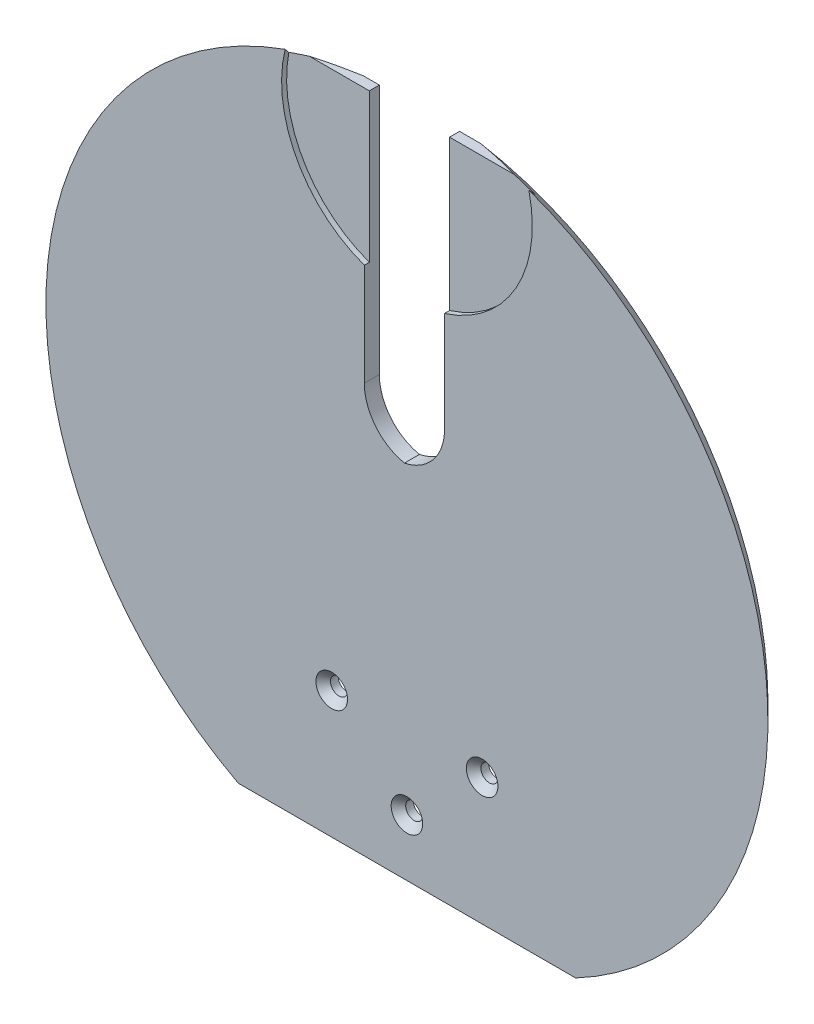
ISO-10303-21;
HEADER;
FILE_DESCRIPTION(('STEP AP214'),'2;1');
FILE_NAME('part.step','',(''),(''),'','','');
FILE_SCHEMA(('AUTOMOTIVE_DESIGN { 1 0 10303 214 1 1 1 1 }'));
ENDSEC;
DATA;
#1=APPLICATION_CONTEXT('core data for automotive mechanical design processes');
#2=APPLICATION_PROTOCOL_DEFINITION('international standard','automotive_design',2000,#1);
#3=PRODUCT_CONTEXT('',#1,'mechanical');
#4=PRODUCT('Part','Part','',(#3));
#5=PRODUCT_RELATED_PRODUCT_CATEGORY('part','',(#4));
#6=PRODUCT_DEFINITION_FORMATION('','',#4);
#7=PRODUCT_DEFINITION_CONTEXT('part definition',#1,'design');
#8=PRODUCT_DEFINITION('design','',#6,#7);
#9=PRODUCT_DEFINITION_SHAPE('','',#8);
#10=(LENGTH_UNIT() NAMED_UNIT(*) SI_UNIT(.MILLI.,.METRE.));
#11=(NAMED_UNIT(*) PLANE_ANGLE_UNIT() SI_UNIT($,.RADIAN.));
#12=(NAMED_UNIT(*) SI_UNIT($,.STERADIAN.) SOLID_ANGLE_UNIT());
#13=UNCERTAINTY_MEASURE_WITH_UNIT(LENGTH_MEASURE(1.E-05),#10,'distance_accuracy_value','');
#14=(GEOMETRIC_REPRESENTATION_CONTEXT(3) GLOBAL_UNCERTAINTY_ASSIGNED_CONTEXT((#13)) GLOBAL_UNIT_ASSIGNED_CONTEXT((#10,
#11,#12)) REPRESENTATION_CONTEXT('',''));
#15=CARTESIAN_POINT('',(0.,0.,0.));
#16=DIRECTION('',(0.,0.,1.));
#17=DIRECTION('',(1.,0.,0.));
#18=AXIS2_PLACEMENT_3D('',#15,#16,#17);
#19=CARTESIAN_POINT('',(-23.6643191323984,68.,3.));
#20=DIRECTION('',(0.,1.,0.));
#21=DIRECTION('',(0.,0.,1.));
#22=AXIS2_PLACEMENT_3D('',#19,#20,#21);
#23=PLANE('',#22);
#24=DIRECTION('',(1.,0.,0.));
#25=VECTOR('',#24,1.);
#26=CARTESIAN_POINT('',(-23.6643191323984,68.,0.));
#27=LINE('',#26,#25);
#28=CARTESIAN_POINT('',(-11.7046999107196,68.,0.));
#29=VERTEX_POINT('',#28);
#30=CARTESIAN_POINT('',(-8.5,68.,0.));
#31=VERTEX_POINT('',#30);
#32=EDGE_CURVE('E157',#29,#31,#27,.T.);
#33=ORIENTED_EDGE('',*,*,#32,.F.);
#34=CARTESIAN_POINT('',(-11.7046999107196,68.,0.));
#35=CARTESIAN_POINT('',(-12.440110253688,68.,0.124734298754301));
#36=CARTESIAN_POINT('',(-13.173608270418,68.,0.26059463660482));
#37=CARTESIAN_POINT('',(-14.63576092202,68.,0.55352933296997));
#38=CARTESIAN_POINT('',(-15.3644189074886,68.,0.710586951614213));
#39=CARTESIAN_POINT('',(-16.8170010181986,68.,1.04507049537918));
#40=CARTESIAN_POINT('',(-17.5409253245415,68.,1.22249563640126));
#41=CARTESIAN_POINT('',(-18.9843193426117,68.,1.59686914311133));
#42=CARTESIAN_POINT('',(-19.7037851070124,68.,1.79383274023498));
#43=CARTESIAN_POINT('',(-20.4205778566621,68.,2.00000000000001));
#44=B_SPLINE_CURVE_WITH_KNOTS('',3,(#34,#35,#36,#37,#38,#39,#40,#41,#42,#43),.UNSPECIFIED.,.F.,
.F.,(4,2,2,2,4),(0.,2.23761978079426,4.47348270177668,6.70925957648,8.94679328311503),.UNSPECIFIED.);
#45=CARTESIAN_POINT('',(-20.4205778566621,68.,2.));
#46=VERTEX_POINT('',#45);
#47=EDGE_CURVE('E284',#29,#46,#44,.T.);
#48=ORIENTED_EDGE('',*,*,#47,.T.);
#49=DIRECTION('',(1.,0.,0.));
#50=VECTOR('',#49,1.);
#51=CARTESIAN_POINT('',(-23.6643191323984,68.,2.));
#52=LINE('',#51,#50);
#53=CARTESIAN_POINT('',(-8.5,68.,2.));
#54=VERTEX_POINT('',#53);
#55=EDGE_CURVE('E178',#46,#54,#52,.T.);
#56=ORIENTED_EDGE('',*,*,#55,.T.);
#57=DIRECTION('',(0.,0.,1.));
#58=VECTOR('',#57,1.);
#59=CARTESIAN_POINT('',(-8.5,68.,-62.0966987850401));
#60=LINE('',#59,#58);
#61=EDGE_CURVE('E188',#31,#54,#60,.T.);
#62=ORIENTED_EDGE('',*,*,#61,.F.);
#63=EDGE_LOOP('',(#33,#48,#56,#62));
#64=FACE_BOUND('',#63,.T.);
#65=ADVANCED_FACE('F40',(#64),#23,.T.);
#66=DIRECTION('',(1.,0.,0.));
#67=VECTOR('',#66,1.);
#68=CARTESIAN_POINT('',(-23.6643191323984,68.,2.));
#69=LINE('',#68,#67);
#70=CARTESIAN_POINT('',(7.5,68.,2.));
#71=VERTEX_POINT('',#70);
#72=CARTESIAN_POINT('',(20.4205778566621,68.,2.));
#73=VERTEX_POINT('',#72);
#74=EDGE_CURVE('E172',#71,#73,#69,.T.);
#75=ORIENTED_EDGE('',*,*,#74,.T.);
#76=CARTESIAN_POINT('',(20.4205778566621,68.,2.));
#77=CARTESIAN_POINT('',(19.7037851070124,68.,1.79383274023497));
#78=CARTESIAN_POINT('',(18.9843193426117,68.,1.59686914311133));
#79=CARTESIAN_POINT('',(17.5409253245416,68.,1.22249563640126));
#80=CARTESIAN_POINT('',(16.8170010181986,68.,1.04507049537917));
#81=CARTESIAN_POINT('',(15.3644189074886,68.,0.71058695161421));
#82=CARTESIAN_POINT('',(14.63576092202,68.,0.553529332969968));
#83=CARTESIAN_POINT('',(13.173608270418,68.,0.260594636604819));
#84=CARTESIAN_POINT('',(12.440110253688,68.,0.124734298754302));
#85=CARTESIAN_POINT('',(11.7046999107196,68.,0.));
#86=B_SPLINE_CURVE_WITH_KNOTS('',3,(#76,#77,#78,#79,#80,#81,#82,#83,#84,#85),.UNSPECIFIED.,.F.,
.F.,(4,2,2,2,4),(0.,2.23753370663504,4.47331058133836,6.70917350232079,8.94679328311506),.UNSPECIFIED.);
#87=CARTESIAN_POINT('',(11.7046999107196,68.,0.));
#88=VERTEX_POINT('',#87);
#89=EDGE_CURVE('E11',#73,#88,#86,.T.);
#90=ORIENTED_EDGE('',*,*,#89,.T.);
#91=CARTESIAN_POINT('',(7.5,68.,0.));
#92=VERTEX_POINT('',#91);
#93=EDGE_CURVE('E221',#92,#88,#27,.T.);
#94=ORIENTED_EDGE('',*,*,#93,.F.);
#95=DIRECTION('',(0.,0.,1.));
#96=VECTOR('',#95,1.);
#97=CARTESIAN_POINT('',(7.5,68.,-62.0966987850401));
#98=LINE('',#97,#96);
#99=EDGE_CURVE('E192',#92,#71,#98,.T.);
#100=ORIENTED_EDGE('',*,*,#99,.T.);
#101=EDGE_LOOP('',(#75,#90,#94,#100));
#102=FACE_BOUND('',#101,.T.);
#103=ADVANCED_FACE('F296',(#102),#23,.T.);
#104=CARTESIAN_POINT('',(0.,0.,0.));
#105=DIRECTION('',(0.,0.,1.));
#106=DIRECTION('',(1.,0.,0.));
#107=AXIS2_PLACEMENT_3D('',#104,#105,#106);
#108=PLANE('',#107);
#109=CARTESIAN_POINT('',(15.,-38.31,0.));
#110=DIRECTION('',(0.,0.,1.));
#111=DIRECTION('',(1.,0.,0.));
#112=AXIS2_PLACEMENT_3D('',#109,#110,#111);
#113=CIRCLE('',#112,1.69999999999999);
#114=CARTESIAN_POINT('',(16.7,-38.31,0.));
#115=VERTEX_POINT('',#114);
#116=EDGE_CURVE('E200',#115,#115,#113,.F.);
#117=ORIENTED_EDGE('',*,*,#116,.F.);
#118=EDGE_LOOP('',(#117));
#119=FACE_BOUND('',#118,.T.);
#120=CARTESIAN_POINT('',(0.,-52.31,0.));
#121=DIRECTION('',(0.,0.,1.));
#122=DIRECTION('',(1.,0.,0.));
#123=AXIS2_PLACEMENT_3D('',#120,#121,#122);
#124=CIRCLE('',#123,1.69999999999999);
#125=CARTESIAN_POINT('',(1.7,-52.31,0.));
#126=VERTEX_POINT('',#125);
#127=EDGE_CURVE('E218',#126,#126,#124,.F.);
#128=ORIENTED_EDGE('',*,*,#127,.F.);
#129=EDGE_LOOP('',(#128));
#130=FACE_BOUND('',#129,.T.);
#131=CARTESIAN_POINT('',(-15.,-38.31,0.));
#132=DIRECTION('',(0.,0.,1.));
#133=DIRECTION('',(1.,0.,0.));
#134=AXIS2_PLACEMENT_3D('',#131,#132,#133);
#135=CIRCLE('',#134,1.69999999999999);
#136=CARTESIAN_POINT('',(-13.3,-38.31,0.));
#137=VERTEX_POINT('',#136);
#138=EDGE_CURVE('E209',#137,#137,#135,.F.);
#139=ORIENTED_EDGE('',*,*,#138,.F.);
#140=EDGE_LOOP('',(#139));
#141=FACE_BOUND('',#140,.T.);
#142=DIRECTION('',(-1.,0.,0.));
#143=VECTOR('',#142,1.);
#144=CARTESIAN_POINT('',(0.,-61.9232486540518,0.));
#145=LINE('',#144,#143);
#146=CARTESIAN_POINT('',(30.4386477381711,-61.9232486540518,0.));
#147=VERTEX_POINT('',#146);
#148=CARTESIAN_POINT('',(-30.4386477381711,-61.9232486540518,0.));
#149=VERTEX_POINT('',#148);
#150=EDGE_CURVE('E245',#147,#149,#145,.T.);
#151=ORIENTED_EDGE('',*,*,#150,.T.);
#152=CARTESIAN_POINT('',(0.,0.,0.));
#153=DIRECTION('',(0.,0.,1.));
#154=DIRECTION('',(1.,0.,0.));
#155=AXIS2_PLACEMENT_3D('',#152,#153,#154);
#156=CIRCLE('',#155,69.);
#157=EDGE_CURVE('E292',#149,#29,#156,.F.);
#158=ORIENTED_EDGE('',*,*,#157,.T.);
#159=ORIENTED_EDGE('',*,*,#32,.T.);
#160=DIRECTION('',(0.,-1.,0.));
#161=VECTOR('',#160,1.);
#162=CARTESIAN_POINT('',(-8.5,0.,0.));
#163=LINE('',#162,#161);
#164=CARTESIAN_POINT('',(-8.5,18.,0.));
#165=VERTEX_POINT('',#164);
#166=EDGE_CURVE('E184',#31,#165,#163,.T.);
#167=ORIENTED_EDGE('',*,*,#166,.T.);
#168=CARTESIAN_POINT('',(1.5,18.,0.));
#169=DIRECTION('',(0.,0.,1.));
#170=DIRECTION('',(1.,0.,0.));
#171=AXIS2_PLACEMENT_3D('',#168,#169,#170);
#172=CIRCLE('',#171,10.);
#173=CARTESIAN_POINT('',(-0.5,8.2020410288673,0.));
#174=VERTEX_POINT('',#173);
#175=EDGE_CURVE('E242',#165,#174,#172,.T.);
#176=ORIENTED_EDGE('',*,*,#175,.T.);
#177=CARTESIAN_POINT('',(-2.5,18.,0.));
#178=DIRECTION('',(0.,0.,1.));
#179=DIRECTION('',(1.,0.,0.));
#180=AXIS2_PLACEMENT_3D('',#177,#178,#179);
#181=CIRCLE('',#180,10.);
#182=CARTESIAN_POINT('',(7.5,18.,0.));
#183=VERTEX_POINT('',#182);
#184=EDGE_CURVE('E238',#174,#183,#181,.T.);
#185=ORIENTED_EDGE('',*,*,#184,.T.);
#186=DIRECTION('',(0.,-1.,0.));
#187=VECTOR('',#186,1.);
#188=CARTESIAN_POINT('',(7.5,0.,0.));
#189=LINE('',#188,#187);
#190=EDGE_CURVE('E187',#92,#183,#189,.T.);
#191=ORIENTED_EDGE('',*,*,#190,.F.);
#192=ORIENTED_EDGE('',*,*,#93,.T.);
#193=CARTESIAN_POINT('',(0.,0.,0.));
#194=DIRECTION('',(0.,0.,1.));
#195=DIRECTION('',(1.,0.,0.));
#196=AXIS2_PLACEMENT_3D('',#193,#194,#195);
#197=CIRCLE('',#196,69.);
#198=EDGE_CURVE('E321',#88,#147,#197,.F.);
#199=ORIENTED_EDGE('',*,*,#198,.T.);
#200=EDGE_LOOP('',(#151,#158,#159,#167,#176,#185,#191,#192,#199));
#201=FACE_BOUND('',#200,.T.);
#202=ADVANCED_FACE('F298',(#119,#130,#141,#201),#108,.F.);
#203=CARTESIAN_POINT('',(0.,0.,3.));
#204=DIRECTION('',(0.,0.,1.));
#205=DIRECTION('',(1.,0.,0.));
#206=AXIS2_PLACEMENT_3D('',#203,#204,#205);
#207=PLANE('',#206);
#208=CARTESIAN_POINT('',(0.,0.,3.));
#209=DIRECTION('',(0.,0.,1.));
#210=DIRECTION('',(1.,0.,0.));
#211=AXIS2_PLACEMENT_3D('',#208,#209,#210);
#212=CIRCLE('',#211,72.);
#213=CARTESIAN_POINT('',(-24.2997573135984,67.7755250403877,3.));
#214=VERTEX_POINT('',#213);
#215=CARTESIAN_POINT('',(-33.6452500429316,-63.6552994616207,3.));
#216=VERTEX_POINT('',#215);
#217=EDGE_CURVE('E156',#214,#216,#212,.T.);
#218=ORIENTED_EDGE('',*,*,#217,.T.);
#219=DIRECTION('',(-1.,0.,0.));
#220=VECTOR('',#219,1.);
#221=CARTESIAN_POINT('',(0.,-63.6552994616207,3.));
#222=LINE('',#221,#220);
#223=CARTESIAN_POINT('',(33.6452500429316,-63.6552994616207,3.));
#224=VERTEX_POINT('',#223);
#225=EDGE_CURVE('E155',#216,#224,#222,.F.);
#226=ORIENTED_EDGE('',*,*,#225,.T.);
#227=CARTESIAN_POINT('',(24.2997573135984,67.7755250403877,3.));
#228=VERTEX_POINT('',#227);
#229=EDGE_CURVE('E142',#224,#228,#212,.T.);
#230=ORIENTED_EDGE('',*,*,#229,.T.);
#231=CARTESIAN_POINT('',(0.,61.9,3.));
#232=DIRECTION('',(0.,0.,1.));
#233=DIRECTION('',(1.,0.,0.));
#234=AXIS2_PLACEMENT_3D('',#231,#232,#233);
#235=CIRCLE('',#234,25.);
#236=CARTESIAN_POINT('',(7.5,38.0515199645764,3.));
#237=VERTEX_POINT('',#236);
#238=EDGE_CURVE('E153',#237,#228,#235,.T.);
#239=ORIENTED_EDGE('',*,*,#238,.F.);
#240=DIRECTION('',(0.,1.,0.));
#241=VECTOR('',#240,1.);
#242=CARTESIAN_POINT('',(7.5,0.,3.));
#243=LINE('',#242,#241);
#244=CARTESIAN_POINT('',(7.5,18.,3.));
#245=VERTEX_POINT('',#244);
#246=EDGE_CURVE('E183',#245,#237,#243,.T.);
#247=ORIENTED_EDGE('',*,*,#246,.F.);
#248=CARTESIAN_POINT('',(-2.5,18.,3.));
#249=DIRECTION('',(0.,0.,1.));
#250=DIRECTION('',(1.,0.,0.));
#251=AXIS2_PLACEMENT_3D('',#248,#249,#250);
#252=CIRCLE('',#251,10.);
#253=CARTESIAN_POINT('',(-0.5,8.2020410288673,3.));
#254=VERTEX_POINT('',#253);
#255=EDGE_CURVE('E236',#245,#254,#252,.F.);
#256=ORIENTED_EDGE('',*,*,#255,.T.);
#257=CARTESIAN_POINT('',(1.5,18.,3.));
#258=DIRECTION('',(0.,0.,1.));
#259=DIRECTION('',(1.,0.,0.));
#260=AXIS2_PLACEMENT_3D('',#257,#258,#259);
#261=CIRCLE('',#260,10.);
#262=CARTESIAN_POINT('',(-8.5,18.,3.));
#263=VERTEX_POINT('',#262);
#264=EDGE_CURVE('E240',#254,#263,#261,.F.);
#265=ORIENTED_EDGE('',*,*,#264,.T.);
#266=DIRECTION('',(0.,1.,0.));
#267=VECTOR('',#266,1.);
#268=CARTESIAN_POINT('',(-8.5,0.,3.));
#269=LINE('',#268,#267);
#270=CARTESIAN_POINT('',(-8.5,38.3893641089825,3.));
#271=VERTEX_POINT('',#270);
#272=EDGE_CURVE('E190',#263,#271,#269,.T.);
#273=ORIENTED_EDGE('',*,*,#272,.T.);
#274=EDGE_CURVE('E163',#214,#271,#235,.T.);
#275=ORIENTED_EDGE('',*,*,#274,.F.);
#276=EDGE_LOOP('',(#218,#226,#230,#239,#247,#256,#265,#273,#275));
#277=FACE_BOUND('',#276,.T.);
#278=CARTESIAN_POINT('',(15.,-38.31,3.));
#279=DIRECTION('',(0.,0.,1.));
#280=DIRECTION('',(1.,0.,0.));
#281=AXIS2_PLACEMENT_3D('',#278,#279,#280);
#282=CIRCLE('',#281,3.15);
#283=CARTESIAN_POINT('',(18.15,-38.31,3.));
#284=VERTEX_POINT('',#283);
#285=EDGE_CURVE('E199',#284,#284,#282,.T.);
#286=ORIENTED_EDGE('',*,*,#285,.F.);
#287=EDGE_LOOP('',(#286));
#288=FACE_BOUND('',#287,.T.);
#289=CARTESIAN_POINT('',(-15.,-38.31,3.));
#290=DIRECTION('',(0.,0.,1.));
#291=DIRECTION('',(1.,0.,0.));
#292=AXIS2_PLACEMENT_3D('',#289,#290,#291);
#293=CIRCLE('',#292,3.15);
#294=CARTESIAN_POINT('',(-11.85,-38.31,3.));
#295=VERTEX_POINT('',#294);
#296=EDGE_CURVE('E203',#295,#295,#293,.T.);
#297=ORIENTED_EDGE('',*,*,#296,.F.);
#298=EDGE_LOOP('',(#297));
#299=FACE_BOUND('',#298,.T.);
#300=CARTESIAN_POINT('',(0.,-52.31,3.));
#301=DIRECTION('',(0.,0.,1.));
#302=DIRECTION('',(1.,0.,0.));
#303=AXIS2_PLACEMENT_3D('',#300,#301,#302);
#304=CIRCLE('',#303,3.15);
#305=CARTESIAN_POINT('',(3.15,-52.31,3.));
#306=VERTEX_POINT('',#305);
#307=EDGE_CURVE('E212',#306,#306,#304,.T.);
#308=ORIENTED_EDGE('',*,*,#307,.F.);
#309=EDGE_LOOP('',(#308));
#310=FACE_BOUND('',#309,.T.);
#311=ADVANCED_FACE('F150',(#277,#288,#299,#310),#207,.T.);
#312=CARTESIAN_POINT('',(0.,-52.31,3.));
#313=DIRECTION('',(0.,0.,1.));
#314=DIRECTION('',(1.,0.,0.));
#315=AXIS2_PLACEMENT_3D('',#312,#313,#314);
#316=CYLINDRICAL_SURFACE('',#315,1.69999999999999);
#317=ORIENTED_EDGE('',*,*,#127,.T.);
#318=EDGE_LOOP('',(#317));
#319=FACE_BOUND('',#318,.T.);
#320=CARTESIAN_POINT('',(0.,-52.31,1.54999999999999));
#321=DIRECTION('',(0.,0.,1.));
#322=DIRECTION('',(1.,0.,0.));
#323=AXIS2_PLACEMENT_3D('',#320,#321,#322);
#324=CIRCLE('',#323,1.69999999999999);
#325=CARTESIAN_POINT('',(1.69999999999999,-52.31,1.54999999999999));
#326=VERTEX_POINT('',#325);
#327=EDGE_CURVE('E222',#326,#326,#324,.T.);
#328=ORIENTED_EDGE('',*,*,#327,.T.);
#329=EDGE_LOOP('',(#328));
#330=FACE_BOUND('',#329,.T.);
#331=ADVANCED_FACE('F382',(#319,#330),#316,.F.);
#332=CARTESIAN_POINT('',(0.,-52.31,3.));
#333=DIRECTION('',(0.,0.,1.));
#334=DIRECTION('',(1.,0.,0.));
#335=AXIS2_PLACEMENT_3D('',#332,#333,#334);
#336=CONICAL_SURFACE('',#335,3.15,0.785398163397449);
#337=ORIENTED_EDGE('',*,*,#327,.F.);
#338=EDGE_LOOP('',(#337));
#339=FACE_BOUND('',#338,.T.);
#340=ORIENTED_EDGE('',*,*,#307,.T.);
#341=EDGE_LOOP('',(#340));
#342=FACE_BOUND('',#341,.T.);
#343=ADVANCED_FACE('F378',(#339,#342),#336,.F.);
#344=CARTESIAN_POINT('',(-15.,-38.31,3.));
#345=DIRECTION('',(0.,0.,1.));
#346=DIRECTION('',(1.,0.,0.));
#347=AXIS2_PLACEMENT_3D('',#344,#345,#346);
#348=CYLINDRICAL_SURFACE('',#347,1.69999999999999);
#349=ORIENTED_EDGE('',*,*,#138,.T.);
#350=EDGE_LOOP('',(#349));
#351=FACE_BOUND('',#350,.T.);
#352=CARTESIAN_POINT('',(-15.,-38.31,1.54999999999999));
#353=DIRECTION('',(0.,0.,1.));
#354=DIRECTION('',(1.,0.,0.));
#355=AXIS2_PLACEMENT_3D('',#352,#353,#354);
#356=CIRCLE('',#355,1.69999999999999);
#357=CARTESIAN_POINT('',(-13.3,-38.31,1.54999999999999));
#358=VERTEX_POINT('',#357);
#359=EDGE_CURVE('E213',#358,#358,#356,.T.);
#360=ORIENTED_EDGE('',*,*,#359,.T.);
#361=EDGE_LOOP('',(#360));
#362=FACE_BOUND('',#361,.T.);
#363=ADVANCED_FACE('F374',(#351,#362),#348,.F.);
#364=CARTESIAN_POINT('',(-15.,-38.31,3.));
#365=DIRECTION('',(0.,0.,1.));
#366=DIRECTION('',(1.,0.,0.));
#367=AXIS2_PLACEMENT_3D('',#364,#365,#366);
#368=CONICAL_SURFACE('',#367,3.15,0.785398163397449);
#369=ORIENTED_EDGE('',*,*,#359,.F.);
#370=EDGE_LOOP('',(#369));
#371=FACE_BOUND('',#370,.T.);
#372=ORIENTED_EDGE('',*,*,#296,.T.);
#373=EDGE_LOOP('',(#372));
#374=FACE_BOUND('',#373,.T.);
#375=ADVANCED_FACE('F370',(#371,#374),#368,.F.);
#376=CARTESIAN_POINT('',(15.,-38.31,3.));
#377=DIRECTION('',(0.,0.,1.));
#378=DIRECTION('',(1.,0.,0.));
#379=AXIS2_PLACEMENT_3D('',#376,#377,#378);
#380=CYLINDRICAL_SURFACE('',#379,1.69999999999999);
#381=ORIENTED_EDGE('',*,*,#116,.T.);
#382=EDGE_LOOP('',(#381));
#383=FACE_BOUND('',#382,.T.);
#384=CARTESIAN_POINT('',(15.,-38.31,1.54999999999999));
#385=DIRECTION('',(0.,0.,1.));
#386=DIRECTION('',(1.,0.,0.));
#387=AXIS2_PLACEMENT_3D('',#384,#385,#386);
#388=CIRCLE('',#387,1.69999999999999);
#389=CARTESIAN_POINT('',(16.7,-38.31,1.54999999999999));
#390=VERTEX_POINT('',#389);
#391=EDGE_CURVE('E204',#390,#390,#388,.T.);
#392=ORIENTED_EDGE('',*,*,#391,.T.);
#393=EDGE_LOOP('',(#392));
#394=FACE_BOUND('',#393,.T.);
#395=ADVANCED_FACE('F366',(#383,#394),#380,.F.);
#396=CARTESIAN_POINT('',(15.,-38.31,3.));
#397=DIRECTION('',(0.,0.,1.));
#398=DIRECTION('',(1.,0.,0.));
#399=AXIS2_PLACEMENT_3D('',#396,#397,#398);
#400=CONICAL_SURFACE('',#399,3.15,0.785398163397448);
#401=ORIENTED_EDGE('',*,*,#391,.F.);
#402=EDGE_LOOP('',(#401));
#403=FACE_BOUND('',#402,.T.);
#404=ORIENTED_EDGE('',*,*,#285,.T.);
#405=EDGE_LOOP('',(#404));
#406=FACE_BOUND('',#405,.T.);
#407=ADVANCED_FACE('F361',(#403,#406),#400,.F.);
#408=CARTESIAN_POINT('',(-8.5,0.,-62.0966987850401));
#409=DIRECTION('',(1.,0.,0.));
#410=DIRECTION('',(0.,0.,-1.));
#411=AXIS2_PLACEMENT_3D('',#408,#409,#410);
#412=PLANE('',#411);
#413=ORIENTED_EDGE('',*,*,#272,.F.);
#414=DIRECTION('',(0.,0.,1.));
#415=VECTOR('',#414,1.);
#416=CARTESIAN_POINT('',(-8.5,18.,-62.0966987850401));
#417=LINE('',#416,#415);
#418=EDGE_CURVE('E234',#263,#165,#417,.F.);
#419=ORIENTED_EDGE('',*,*,#418,.T.);
#420=ORIENTED_EDGE('',*,*,#166,.F.);
#421=ORIENTED_EDGE('',*,*,#61,.T.);
#422=DIRECTION('',(0.,-1.,0.));
#423=VECTOR('',#422,1.);
#424=CARTESIAN_POINT('',(-8.5,0.,2.));
#425=LINE('',#424,#423);
#426=CARTESIAN_POINT('',(-8.5,38.3893641089825,2.));
#427=VERTEX_POINT('',#426);
#428=EDGE_CURVE('E174',#54,#427,#425,.T.);
#429=ORIENTED_EDGE('',*,*,#428,.T.);
#430=DIRECTION('',(0.,0.,1.));
#431=VECTOR('',#430,1.);
#432=CARTESIAN_POINT('',(-8.5,38.3893641089825,2.));
#433=LINE('',#432,#431);
#434=EDGE_CURVE('E180',#271,#427,#433,.F.);
#435=ORIENTED_EDGE('',*,*,#434,.F.);
#436=EDGE_LOOP('',(#413,#419,#420,#421,#429,#435));
#437=FACE_BOUND('',#436,.T.);
#438=ADVANCED_FACE('F338',(#437),#412,.T.);
#439=CARTESIAN_POINT('',(7.5,0.,-62.0966987850401));
#440=DIRECTION('',(1.,0.,0.));
#441=DIRECTION('',(0.,1.,0.));
#442=AXIS2_PLACEMENT_3D('',#439,#440,#441);
#443=PLANE('',#442);
#444=ORIENTED_EDGE('',*,*,#190,.T.);
#445=DIRECTION('',(0.,0.,1.));
#446=VECTOR('',#445,1.);
#447=CARTESIAN_POINT('',(7.5,18.,3.));
#448=LINE('',#447,#446);
#449=EDGE_CURVE('E231',#183,#245,#448,.T.);
#450=ORIENTED_EDGE('',*,*,#449,.T.);
#451=ORIENTED_EDGE('',*,*,#246,.T.);
#452=DIRECTION('',(0.,0.,1.));
#453=VECTOR('',#452,1.);
#454=CARTESIAN_POINT('',(7.5,38.0515199645764,2.));
#455=LINE('',#454,#453);
#456=CARTESIAN_POINT('',(7.5,38.0515199645764,2.));
#457=VERTEX_POINT('',#456);
#458=EDGE_CURVE('E162',#237,#457,#455,.F.);
#459=ORIENTED_EDGE('',*,*,#458,.T.);
#460=DIRECTION('',(0.,-1.,0.));
#461=VECTOR('',#460,1.);
#462=CARTESIAN_POINT('',(7.5,0.,2.));
#463=LINE('',#462,#461);
#464=EDGE_CURVE('E227',#71,#457,#463,.T.);
#465=ORIENTED_EDGE('',*,*,#464,.F.);
#466=ORIENTED_EDGE('',*,*,#99,.F.);
#467=EDGE_LOOP('',(#444,#450,#451,#459,#465,#466));
#468=FACE_BOUND('',#467,.T.);
#469=ADVANCED_FACE('F317',(#468),#443,.F.);
#470=CARTESIAN_POINT('',(0.,61.9,2.));
#471=DIRECTION('',(0.,0.,1.));
#472=DIRECTION('',(1.,0.,0.));
#473=AXIS2_PLACEMENT_3D('',#470,#471,#472);
#474=PLANE('',#473);
#475=CARTESIAN_POINT('',(0.,61.9,2.));
#476=DIRECTION('',(0.,0.,1.));
#477=DIRECTION('',(1.,0.,0.));
#478=AXIS2_PLACEMENT_3D('',#475,#476,#477);
#479=CIRCLE('',#478,25.);
#480=CARTESIAN_POINT('',(24.5503051345741,66.620436187399,2.));
#481=VERTEX_POINT('',#480);
#482=EDGE_CURVE('E167',#457,#481,#479,.T.);
#483=ORIENTED_EDGE('',*,*,#482,.T.);
#484=CARTESIAN_POINT('',(0.,0.,2.));
#485=DIRECTION('',(0.,0.,1.));
#486=DIRECTION('',(1.,0.,0.));
#487=AXIS2_PLACEMENT_3D('',#484,#485,#486);
#488=CIRCLE('',#487,71.);
#489=EDGE_CURVE('E55',#481,#73,#488,.T.);
#490=ORIENTED_EDGE('',*,*,#489,.T.);
#491=ORIENTED_EDGE('',*,*,#74,.F.);
#492=ORIENTED_EDGE('',*,*,#464,.T.);
#493=EDGE_LOOP('',(#483,#490,#491,#492));
#494=FACE_BOUND('',#493,.T.);
#495=ADVANCED_FACE('F357',(#494),#474,.T.);
#496=CARTESIAN_POINT('',(0.,61.9,2.));
#497=DIRECTION('',(0.,0.,1.));
#498=DIRECTION('',(1.,0.,0.));
#499=AXIS2_PLACEMENT_3D('',#496,#497,#498);
#500=CYLINDRICAL_SURFACE('',#499,25.);
#501=ORIENTED_EDGE('',*,*,#238,.T.);
#502=CARTESIAN_POINT('',(24.2997573135984,67.7755250403877,2.99999999999999));
#503=CARTESIAN_POINT('',(24.3462779068515,67.5830239747103,2.83451071789395));
#504=CARTESIAN_POINT('',(24.3904171888239,67.3905160360795,2.66843274230773));
#505=CARTESIAN_POINT('',(24.473933129013,67.0054864184162,2.33509940894074));
#506=CARTESIAN_POINT('',(24.5133097873659,66.8129647393841,2.16784405119364));
#507=CARTESIAN_POINT('',(24.5503051345742,66.620436187399,2.00000000000003));
#508=B_SPLINE_CURVE_WITH_KNOTS('',3,(#502,#503,#504,#505,#506,#507),.UNSPECIFIED.,.F.,.F.,(4,2,
4),(0.,0.774148105735308,1.54829618933394),.UNSPECIFIED.);
#509=EDGE_CURVE('E69',#228,#481,#508,.T.);
#510=ORIENTED_EDGE('',*,*,#509,.T.);
#511=ORIENTED_EDGE('',*,*,#482,.F.);
#512=ORIENTED_EDGE('',*,*,#458,.F.);
#513=EDGE_LOOP('',(#501,#510,#511,#512));
#514=FACE_BOUND('',#513,.T.);
#515=ADVANCED_FACE('F160',(#514),#500,.F.);
#516=CARTESIAN_POINT('',(-24.5503051345741,66.620436187399,2.));
#517=VERTEX_POINT('',#516);
#518=EDGE_CURVE('E175',#517,#427,#479,.T.);
#519=ORIENTED_EDGE('',*,*,#518,.F.);
#520=CARTESIAN_POINT('',(-24.5503051345741,66.620436187399,2.));
#521=CARTESIAN_POINT('',(-24.5133097873658,66.8129647393841,2.16784405119363));
#522=CARTESIAN_POINT('',(-24.473933129013,67.0054864184162,2.33509940894074));
#523=CARTESIAN_POINT('',(-24.3904171888239,67.3905160360795,2.66843274230775));
#524=CARTESIAN_POINT('',(-24.3462779068516,67.5830239747102,2.83451071789398));
#525=CARTESIAN_POINT('',(-24.2997573135985,67.7755250403877,3.00000000000004));
#526=B_SPLINE_CURVE_WITH_KNOTS('',3,(#520,#521,#522,#523,#524,#525),.UNSPECIFIED.,.F.,.F.,(4,2,
4),(0.,0.774148083598635,1.54829618933395),.UNSPECIFIED.);
#527=EDGE_CURVE('E144',#517,#214,#526,.T.);
#528=ORIENTED_EDGE('',*,*,#527,.T.);
#529=ORIENTED_EDGE('',*,*,#274,.T.);
#530=ORIENTED_EDGE('',*,*,#434,.T.);
#531=EDGE_LOOP('',(#519,#528,#529,#530));
#532=FACE_BOUND('',#531,.T.);
#533=ADVANCED_FACE('F343',(#532),#500,.F.);
#534=ORIENTED_EDGE('',*,*,#55,.F.);
#535=CARTESIAN_POINT('',(0.,0.,2.));
#536=DIRECTION('',(0.,0.,1.));
#537=DIRECTION('',(1.,0.,0.));
#538=AXIS2_PLACEMENT_3D('',#535,#536,#537);
#539=CIRCLE('',#538,71.);
#540=EDGE_CURVE('E291',#46,#517,#539,.T.);
#541=ORIENTED_EDGE('',*,*,#540,.T.);
#542=ORIENTED_EDGE('',*,*,#518,.T.);
#543=ORIENTED_EDGE('',*,*,#428,.F.);
#544=EDGE_LOOP('',(#534,#541,#542,#543));
#545=FACE_BOUND('',#544,.T.);
#546=ADVANCED_FACE('F306',(#545),#474,.T.);
#547=CARTESIAN_POINT('',(1.5,18.,-62.0966987850401));
#548=DIRECTION('',(0.,0.,1.));
#549=DIRECTION('',(1.,0.,0.));
#550=AXIS2_PLACEMENT_3D('',#547,#548,#549);
#551=CYLINDRICAL_SURFACE('',#550,10.);
#552=DIRECTION('',(0.,0.,1.));
#553=VECTOR('',#552,1.);
#554=CARTESIAN_POINT('',(-0.5,8.2020410288673,1.5));
#555=LINE('',#554,#553);
#556=EDGE_CURVE('E164',#174,#254,#555,.T.);
#557=ORIENTED_EDGE('',*,*,#556,.F.);
#558=ORIENTED_EDGE('',*,*,#175,.F.);
#559=ORIENTED_EDGE('',*,*,#418,.F.);
#560=ORIENTED_EDGE('',*,*,#264,.F.);
#561=EDGE_LOOP('',(#557,#558,#559,#560));
#562=FACE_BOUND('',#561,.T.);
#563=ADVANCED_FACE('F272',(#562),#551,.F.);
#564=CARTESIAN_POINT('',(-2.5,18.,-62.0966987850401));
#565=DIRECTION('',(0.,0.,-1.));
#566=DIRECTION('',(-1.,0.,0.));
#567=AXIS2_PLACEMENT_3D('',#564,#565,#566);
#568=CYLINDRICAL_SURFACE('',#567,10.);
#569=ORIENTED_EDGE('',*,*,#184,.F.);
#570=ORIENTED_EDGE('',*,*,#556,.T.);
#571=ORIENTED_EDGE('',*,*,#255,.F.);
#572=ORIENTED_EDGE('',*,*,#449,.F.);
#573=EDGE_LOOP('',(#569,#570,#571,#572));
#574=FACE_BOUND('',#573,.T.);
#575=ADVANCED_FACE('F270',(#574),#568,.F.);
#576=CARTESIAN_POINT('',(0.,-64.81,5.00000000000002));
#577=DIRECTION('',(0.,0.866025403784435,0.500000000000006));
#578=DIRECTION('',(1.,0.,0.));
#579=AXIS2_PLACEMENT_3D('',#576,#577,#578);
#580=PLANE('',#579);
#581=ORIENTED_EDGE('',*,*,#225,.F.);
#582=CARTESIAN_POINT('',(-33.6452500429316,-63.6552994616207,3.));
#583=CARTESIAN_POINT('',(-33.3809198763989,-63.5096312595196,2.7476952729136));
#584=CARTESIAN_POINT('',(-33.1159207308429,-63.3642661558299,2.49591552767556));
#585=CARTESIAN_POINT('',(-32.584512483115,-63.0741889566082,1.99348708050632));
#586=CARTESIAN_POINT('',(-32.3181034191949,-62.9294768435557,1.74283834822867));
#587=CARTESIAN_POINT('',(-31.7837885495102,-62.6407442845287,1.2427388861946));
#588=CARTESIAN_POINT('',(-31.5158827408039,-62.4967238399147,0.993288158794483));
#589=CARTESIAN_POINT('',(-30.9784793731692,-62.2094201080489,0.495663497998816));
#590=CARTESIAN_POINT('',(-30.7089817714653,-62.0661368408023,0.247489599253241));
#591=CARTESIAN_POINT('',(-30.4386477381711,-61.9232486540518,0.));
#592=B_SPLINE_CURVE_WITH_KNOTS('',3,(#582,#583,#584,#585,#586,#587,#588,#589,#590,#591),
.UNSPECIFIED.,.F.,.F.,(4,2,2,2,4),(0.,1.18013792502789,2.36024399496539,3.54035238505605,
4.72049263321354),.UNSPECIFIED.);
#593=EDGE_CURVE('E255',#216,#149,#592,.T.);
#594=ORIENTED_EDGE('',*,*,#593,.T.);
#595=ORIENTED_EDGE('',*,*,#150,.F.);
#596=CARTESIAN_POINT('',(30.4386477381711,-61.9232486540518,0.));
#597=CARTESIAN_POINT('',(30.7089817714653,-62.0661368408023,0.247489599253242));
#598=CARTESIAN_POINT('',(30.9784793731692,-62.2094201080489,0.495663497998816));
#599=CARTESIAN_POINT('',(31.5158827408039,-62.4967238399147,0.993288158794483));
#600=CARTESIAN_POINT('',(31.7837885495102,-62.6407442845287,1.2427388861946));
#601=CARTESIAN_POINT('',(32.3181034191949,-62.9294768435557,1.74283834822868));
#602=CARTESIAN_POINT('',(32.5845124831151,-63.0741889566082,1.99348708050632));
#603=CARTESIAN_POINT('',(33.1159207308429,-63.3642661558299,2.49591552767556));
#604=CARTESIAN_POINT('',(33.380919876399,-63.5096312595196,2.7476952729136));
#605=CARTESIAN_POINT('',(33.6452500429316,-63.6552994616207,2.99999999999999));
#606=B_SPLINE_CURVE_WITH_KNOTS('',3,(#596,#597,#598,#599,#600,#601,#602,#603,#604,#605),
.UNSPECIFIED.,.F.,.F.,(4,2,2,2,4),(0.,1.18014024815749,2.36024863824816,3.54035470818566,
4.72049263321355),.UNSPECIFIED.);
#607=EDGE_CURVE('E248',#147,#224,#606,.T.);
#608=ORIENTED_EDGE('',*,*,#607,.T.);
#609=EDGE_LOOP('',(#581,#594,#595,#608));
#610=FACE_BOUND('',#609,.T.);
#611=ADVANCED_FACE('F262',(#610),#580,.F.);
#612=CARTESIAN_POINT('',(0.,0.,3.));
#613=DIRECTION('',(0.,0.,1.));
#614=DIRECTION('',(1.,0.,0.));
#615=AXIS2_PLACEMENT_3D('',#612,#613,#614);
#616=CONICAL_SURFACE('',#615,72.,0.785398163397446);
#617=ORIENTED_EDGE('',*,*,#47,.F.);
#618=ORIENTED_EDGE('',*,*,#157,.F.);
#619=ORIENTED_EDGE('',*,*,#593,.F.);
#620=ORIENTED_EDGE('',*,*,#217,.F.);
#621=ORIENTED_EDGE('',*,*,#527,.F.);
#622=ORIENTED_EDGE('',*,*,#540,.F.);
#623=EDGE_LOOP('',(#617,#618,#619,#620,#621,#622));
#624=FACE_BOUND('',#623,.T.);
#625=ADVANCED_FACE('F269',(#624),#616,.T.);
#626=CARTESIAN_POINT('',(0.,0.,2.99999999999999));
#627=DIRECTION('',(0.,0.,1.));
#628=DIRECTION('',(1.,0.,0.));
#629=AXIS2_PLACEMENT_3D('',#626,#627,#628);
#630=CONICAL_SURFACE('',#629,72.,0.785398163397448);
#631=ORIENTED_EDGE('',*,*,#607,.F.);
#632=ORIENTED_EDGE('',*,*,#198,.F.);
#633=ORIENTED_EDGE('',*,*,#89,.F.);
#634=ORIENTED_EDGE('',*,*,#489,.F.);
#635=ORIENTED_EDGE('',*,*,#509,.F.);
#636=ORIENTED_EDGE('',*,*,#229,.F.);
#637=EDGE_LOOP('',(#631,#632,#633,#634,#635,#636));
#638=FACE_BOUND('',#637,.T.);
#639=ADVANCED_FACE('F43',(#638),#630,.T.);
#640=CLOSED_SHELL('',(#65,#103,#202,#311,#331,#343,#363,#375,#395,#407,#438,#469,#495,#515,#533,
#546,#563,#575,#611,#625,#639));
#641=MANIFOLD_SOLID_BREP('B2',#640);
#642=ADVANCED_BREP_SHAPE_REPRESENTATION('',(#18,#641),#14);
#643=SHAPE_DEFINITION_REPRESENTATION(#9,#642);
ENDSEC;
END-ISO-10303-21;
